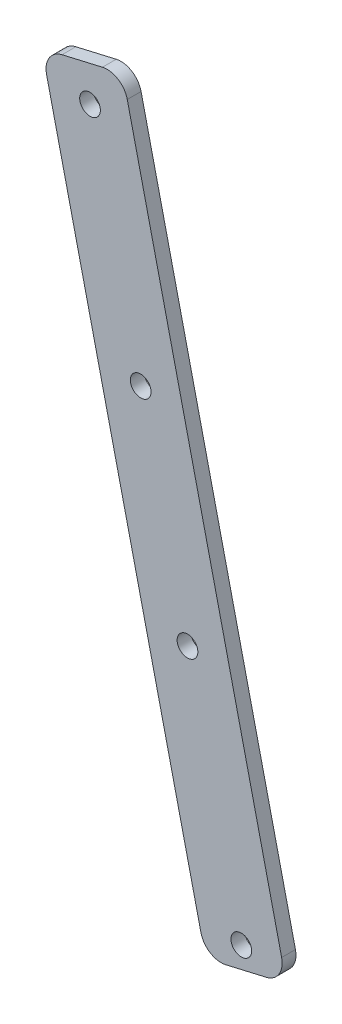
ISO-10303-21;
HEADER;
FILE_DESCRIPTION(('STEP AP214'),'2;1');
FILE_NAME('part.step','',(''),(''),'','','');
FILE_SCHEMA(('AUTOMOTIVE_DESIGN { 1 0 10303 214 1 1 1 1 }'));
ENDSEC;
DATA;
#1=APPLICATION_CONTEXT('core data for automotive mechanical design processes');
#2=APPLICATION_PROTOCOL_DEFINITION('international standard','automotive_design',2000,#1);
#3=PRODUCT_CONTEXT('',#1,'mechanical');
#4=PRODUCT('Part','Part','',(#3));
#5=PRODUCT_RELATED_PRODUCT_CATEGORY('part','',(#4));
#6=PRODUCT_DEFINITION_FORMATION('','',#4);
#7=PRODUCT_DEFINITION_CONTEXT('part definition',#1,'design');
#8=PRODUCT_DEFINITION('design','',#6,#7);
#9=PRODUCT_DEFINITION_SHAPE('','',#8);
#10=(LENGTH_UNIT() NAMED_UNIT(*) SI_UNIT(.MILLI.,.METRE.));
#11=(NAMED_UNIT(*) PLANE_ANGLE_UNIT() SI_UNIT($,.RADIAN.));
#12=(NAMED_UNIT(*) SI_UNIT($,.STERADIAN.) SOLID_ANGLE_UNIT());
#13=UNCERTAINTY_MEASURE_WITH_UNIT(LENGTH_MEASURE(1.E-05),#10,'distance_accuracy_value','');
#14=(GEOMETRIC_REPRESENTATION_CONTEXT(3) GLOBAL_UNCERTAINTY_ASSIGNED_CONTEXT((#13)) GLOBAL_UNIT_ASSIGNED_CONTEXT((#10,
#11,#12)) REPRESENTATION_CONTEXT('',''));
#15=CARTESIAN_POINT('',(0.,0.,0.));
#16=DIRECTION('',(0.,0.,1.));
#17=DIRECTION('',(1.,0.,0.));
#18=AXIS2_PLACEMENT_3D('',#15,#16,#17);
#19=CARTESIAN_POINT('',(11.6435852257325,-63.5112346210582,2.));
#20=DIRECTION('',(0.,0.,1.));
#21=DIRECTION('',(1.,0.,0.));
#22=AXIS2_PLACEMENT_3D('',#19,#20,#21);
#23=PLANE('',#22);
#24=CARTESIAN_POINT('',(6.77492319426459,-29.2249964193636,2.));
#25=DIRECTION('',(0.,0.,1.));
#26=DIRECTION('',(1.,0.,0.));
#27=AXIS2_PLACEMENT_3D('',#24,#25,#26);
#28=CIRCLE('',#27,1.5);
#29=CARTESIAN_POINT('',(8.27492319426459,-29.2249964193636,2.));
#30=VERTEX_POINT('',#29);
#31=EDGE_CURVE('E190',#30,#30,#28,.T.);
#32=ORIENTED_EDGE('',*,*,#31,.F.);
#33=EDGE_LOOP('',(#32));
#34=FACE_BOUND('',#33,.T.);
#35=CARTESIAN_POINT('',(-7.33950012711994,31.660412787644,2.));
#36=DIRECTION('',(0.,0.,1.));
#37=DIRECTION('',(1.,0.,0.));
#38=AXIS2_PLACEMENT_3D('',#35,#36,#37);
#39=CIRCLE('',#38,1.5);
#40=CARTESIAN_POINT('',(-5.83950012711995,31.660412787644,2.));
#41=VERTEX_POINT('',#40);
#42=EDGE_CURVE('E136',#41,#41,#39,.T.);
#43=ORIENTED_EDGE('',*,*,#42,.F.);
#44=EDGE_LOOP('',(#43));
#45=FACE_BOUND('',#44,.T.);
#46=CARTESIAN_POINT('',(11.6435852257325,-63.5112346210582,2.));
#47=DIRECTION('',(0.,0.,1.));
#48=DIRECTION('',(1.,0.,0.));
#49=AXIS2_PLACEMENT_3D('',#46,#47,#48);
#50=CIRCLE('',#49,3.);
#51=CARTESIAN_POINT('',(8.72108558379612,-64.1887269404847,2.));
#52=VERTEX_POINT('',#51);
#53=CARTESIAN_POINT('',(12.3210775451589,-66.4337342629946,2.));
#54=VERTEX_POINT('',#53);
#55=EDGE_CURVE('E147',#52,#54,#50,.T.);
#56=ORIENTED_EDGE('',*,*,#55,.T.);
#57=DIRECTION('',(0.97416654731212,0.225830773142153,0.));
#58=VECTOR('',#57,1.);
#59=CARTESIAN_POINT('',(12.3210775451589,-66.4337342629946,2.));
#60=LINE('',#59,#58);
#61=CARTESIAN_POINT('',(18.1660768290316,-65.0787496241417,2.));
#62=VERTEX_POINT('',#61);
#63=EDGE_CURVE('E95',#54,#62,#60,.T.);
#64=ORIENTED_EDGE('',*,*,#63,.T.);
#65=CARTESIAN_POINT('',(17.4885845096052,-62.1562499822053,2.));
#66=DIRECTION('',(0.,0.,1.));
#67=DIRECTION('',(1.,0.,0.));
#68=AXIS2_PLACEMENT_3D('',#65,#66,#67);
#69=CIRCLE('',#68,3.);
#70=CARTESIAN_POINT('',(20.4110841515416,-61.4787576627788,2.));
#71=VERTEX_POINT('',#70);
#72=EDGE_CURVE('E162',#62,#71,#69,.T.);
#73=ORIENTED_EDGE('',*,*,#72,.T.);
#74=DIRECTION('',(-0.225830773142153,0.97416654731212,0.));
#75=VECTOR('',#74,1.);
#76=CARTESIAN_POINT('',(20.4110841515416,-61.4787576627788,2.));
#77=LINE('',#76,#75);
#78=CARTESIAN_POINT('',(-1.94616238953154,34.9637305211211,2.));
#79=VERTEX_POINT('',#78);
#80=EDGE_CURVE('E175',#71,#79,#77,.T.);
#81=ORIENTED_EDGE('',*,*,#80,.T.);
#82=CARTESIAN_POINT('',(-4.8686620314679,34.2862382016946,2.));
#83=DIRECTION('',(0.,0.,1.));
#84=DIRECTION('',(1.,0.,0.));
#85=AXIS2_PLACEMENT_3D('',#82,#83,#84);
#86=CIRCLE('',#85,3.);
#87=CARTESIAN_POINT('',(-5.54615435089436,37.208737843631,2.));
#88=VERTEX_POINT('',#87);
#89=EDGE_CURVE('E114',#79,#88,#86,.T.);
#90=ORIENTED_EDGE('',*,*,#89,.T.);
#91=DIRECTION('',(-0.97416654731212,-0.225830773142152,0.));
#92=VECTOR('',#91,1.);
#93=CARTESIAN_POINT('',(-5.54615435089436,37.208737843631,2.));
#94=LINE('',#93,#92);
#95=CARTESIAN_POINT('',(-11.3911536347671,35.8537532047781,2.));
#96=VERTEX_POINT('',#95);
#97=EDGE_CURVE('E108',#88,#96,#94,.T.);
#98=ORIENTED_EDGE('',*,*,#97,.T.);
#99=CARTESIAN_POINT('',(-10.7136613153406,32.9312535628417,2.));
#100=DIRECTION('',(0.,0.,1.));
#101=DIRECTION('',(1.,0.,0.));
#102=AXIS2_PLACEMENT_3D('',#99,#100,#101);
#103=CIRCLE('',#102,3.);
#104=CARTESIAN_POINT('',(-13.636160957277,32.2537612434152,2.));
#105=VERTEX_POINT('',#104);
#106=EDGE_CURVE('E112',#96,#105,#103,.T.);
#107=ORIENTED_EDGE('',*,*,#106,.T.);
#108=DIRECTION('',(0.225830773142153,-0.97416654731212,0.));
#109=VECTOR('',#108,1.);
#110=CARTESIAN_POINT('',(-13.636160957277,32.2537612434152,2.));
#111=LINE('',#110,#109);
#112=EDGE_CURVE('E52',#105,#52,#111,.T.);
#113=ORIENTED_EDGE('',*,*,#112,.T.);
#114=EDGE_LOOP('',(#56,#64,#73,#81,#90,#98,#107,#113));
#115=FACE_BOUND('',#114,.T.);
#116=CARTESIAN_POINT('',(0.,0.,2.));
#117=DIRECTION('',(0.,0.,1.));
#118=DIRECTION('',(1.,0.,0.));
#119=AXIS2_PLACEMENT_3D('',#116,#117,#118);
#120=CIRCLE('',#119,1.5);
#121=CARTESIAN_POINT('',(1.5,0.,2.));
#122=VERTEX_POINT('',#121);
#123=EDGE_CURVE('E184',#122,#122,#120,.T.);
#124=ORIENTED_EDGE('',*,*,#123,.F.);
#125=EDGE_LOOP('',(#124));
#126=FACE_BOUND('',#125,.T.);
#127=CARTESIAN_POINT('',(14.5660848676688,-62.8337423016317,2.));
#128=DIRECTION('',(0.,0.,1.));
#129=DIRECTION('',(1.,0.,0.));
#130=AXIS2_PLACEMENT_3D('',#127,#128,#129);
#131=CIRCLE('',#130,1.5);
#132=CARTESIAN_POINT('',(16.0660848676688,-62.8337423016317,2.));
#133=VERTEX_POINT('',#132);
#134=EDGE_CURVE('E196',#133,#133,#131,.T.);
#135=ORIENTED_EDGE('',*,*,#134,.F.);
#136=EDGE_LOOP('',(#135));
#137=FACE_BOUND('',#136,.T.);
#138=ADVANCED_FACE('F35',(#34,#45,#115,#126,#137),#23,.T.);
#139=CARTESIAN_POINT('',(11.6435852257325,-63.5112346210582,0.));
#140=DIRECTION('',(0.,0.,1.));
#141=DIRECTION('',(1.,0.,0.));
#142=AXIS2_PLACEMENT_3D('',#139,#140,#141);
#143=PLANE('',#142);
#144=CARTESIAN_POINT('',(11.6435852257325,-63.5112346210582,0.));
#145=DIRECTION('',(0.,0.,1.));
#146=DIRECTION('',(1.,0.,0.));
#147=AXIS2_PLACEMENT_3D('',#144,#145,#146);
#148=CIRCLE('',#147,3.);
#149=CARTESIAN_POINT('',(8.72108558379612,-64.1887269404847,0.));
#150=VERTEX_POINT('',#149);
#151=CARTESIAN_POINT('',(12.3210775451589,-66.4337342629946,0.));
#152=VERTEX_POINT('',#151);
#153=EDGE_CURVE('E132',#150,#152,#148,.T.);
#154=ORIENTED_EDGE('',*,*,#153,.F.);
#155=DIRECTION('',(0.225830773142153,-0.97416654731212,0.));
#156=VECTOR('',#155,1.);
#157=CARTESIAN_POINT('',(-13.636160957277,32.2537612434152,0.));
#158=LINE('',#157,#156);
#159=CARTESIAN_POINT('',(-13.636160957277,32.2537612434152,0.));
#160=VERTEX_POINT('',#159);
#161=EDGE_CURVE('E87',#160,#150,#158,.T.);
#162=ORIENTED_EDGE('',*,*,#161,.F.);
#163=CARTESIAN_POINT('',(-10.7136613153406,32.9312535628417,0.));
#164=DIRECTION('',(0.,0.,1.));
#165=DIRECTION('',(1.,0.,0.));
#166=AXIS2_PLACEMENT_3D('',#163,#164,#165);
#167=CIRCLE('',#166,3.);
#168=CARTESIAN_POINT('',(-11.3911536347671,35.8537532047781,0.));
#169=VERTEX_POINT('',#168);
#170=EDGE_CURVE('E81',#169,#160,#167,.T.);
#171=ORIENTED_EDGE('',*,*,#170,.F.);
#172=DIRECTION('',(-0.97416654731212,-0.225830773142152,0.));
#173=VECTOR('',#172,1.);
#174=CARTESIAN_POINT('',(-5.54615435089436,37.208737843631,0.));
#175=LINE('',#174,#173);
#176=CARTESIAN_POINT('',(-5.54615435089436,37.208737843631,0.));
#177=VERTEX_POINT('',#176);
#178=EDGE_CURVE('E122',#177,#169,#175,.T.);
#179=ORIENTED_EDGE('',*,*,#178,.F.);
#180=CARTESIAN_POINT('',(-4.8686620314679,34.2862382016946,0.));
#181=DIRECTION('',(0.,0.,1.));
#182=DIRECTION('',(1.,0.,0.));
#183=AXIS2_PLACEMENT_3D('',#180,#181,#182);
#184=CIRCLE('',#183,3.);
#185=CARTESIAN_POINT('',(-1.94616238953154,34.9637305211211,0.));
#186=VERTEX_POINT('',#185);
#187=EDGE_CURVE('E142',#186,#177,#184,.T.);
#188=ORIENTED_EDGE('',*,*,#187,.F.);
#189=DIRECTION('',(-0.225830773142153,0.97416654731212,0.));
#190=VECTOR('',#189,1.);
#191=CARTESIAN_POINT('',(20.4110841515416,-61.4787576627788,0.));
#192=LINE('',#191,#190);
#193=CARTESIAN_POINT('',(20.4110841515416,-61.4787576627788,0.));
#194=VERTEX_POINT('',#193);
#195=EDGE_CURVE('E140',#194,#186,#192,.T.);
#196=ORIENTED_EDGE('',*,*,#195,.F.);
#197=CARTESIAN_POINT('',(17.4885845096052,-62.1562499822053,0.));
#198=DIRECTION('',(0.,0.,1.));
#199=DIRECTION('',(1.,0.,0.));
#200=AXIS2_PLACEMENT_3D('',#197,#198,#199);
#201=CIRCLE('',#200,3.);
#202=CARTESIAN_POINT('',(18.1660768290316,-65.0787496241417,0.));
#203=VERTEX_POINT('',#202);
#204=EDGE_CURVE('E138',#203,#194,#201,.T.);
#205=ORIENTED_EDGE('',*,*,#204,.F.);
#206=DIRECTION('',(0.97416654731212,0.225830773142153,0.));
#207=VECTOR('',#206,1.);
#208=CARTESIAN_POINT('',(12.3210775451589,-66.4337342629946,0.));
#209=LINE('',#208,#207);
#210=EDGE_CURVE('E135',#152,#203,#209,.T.);
#211=ORIENTED_EDGE('',*,*,#210,.F.);
#212=EDGE_LOOP('',(#154,#162,#171,#179,#188,#196,#205,#211));
#213=FACE_BOUND('',#212,.T.);
#214=CARTESIAN_POINT('',(-7.33950012711994,31.660412787644,0.));
#215=DIRECTION('',(0.,0.,1.));
#216=DIRECTION('',(1.,0.,0.));
#217=AXIS2_PLACEMENT_3D('',#214,#215,#216);
#218=CIRCLE('',#217,1.5);
#219=CARTESIAN_POINT('',(-5.83950012711995,31.660412787644,0.));
#220=VERTEX_POINT('',#219);
#221=EDGE_CURVE('E181',#220,#220,#218,.T.);
#222=ORIENTED_EDGE('',*,*,#221,.T.);
#223=EDGE_LOOP('',(#222));
#224=FACE_BOUND('',#223,.T.);
#225=CARTESIAN_POINT('',(0.,0.,0.));
#226=DIRECTION('',(0.,0.,1.));
#227=DIRECTION('',(1.,0.,0.));
#228=AXIS2_PLACEMENT_3D('',#225,#226,#227);
#229=CIRCLE('',#228,1.5);
#230=CARTESIAN_POINT('',(1.5,0.,0.));
#231=VERTEX_POINT('',#230);
#232=EDGE_CURVE('E187',#231,#231,#229,.T.);
#233=ORIENTED_EDGE('',*,*,#232,.T.);
#234=EDGE_LOOP('',(#233));
#235=FACE_BOUND('',#234,.T.);
#236=CARTESIAN_POINT('',(6.77492319426459,-29.2249964193636,0.));
#237=DIRECTION('',(0.,0.,1.));
#238=DIRECTION('',(1.,0.,0.));
#239=AXIS2_PLACEMENT_3D('',#236,#237,#238);
#240=CIRCLE('',#239,1.5);
#241=CARTESIAN_POINT('',(8.27492319426459,-29.2249964193636,0.));
#242=VERTEX_POINT('',#241);
#243=EDGE_CURVE('E193',#242,#242,#240,.T.);
#244=ORIENTED_EDGE('',*,*,#243,.T.);
#245=EDGE_LOOP('',(#244));
#246=FACE_BOUND('',#245,.T.);
#247=CARTESIAN_POINT('',(14.5660848676688,-62.8337423016317,0.));
#248=DIRECTION('',(0.,0.,1.));
#249=DIRECTION('',(1.,0.,0.));
#250=AXIS2_PLACEMENT_3D('',#247,#248,#249);
#251=CIRCLE('',#250,1.5);
#252=CARTESIAN_POINT('',(16.0660848676688,-62.8337423016317,0.));
#253=VERTEX_POINT('',#252);
#254=EDGE_CURVE('E199',#253,#253,#251,.T.);
#255=ORIENTED_EDGE('',*,*,#254,.T.);
#256=EDGE_LOOP('',(#255));
#257=FACE_BOUND('',#256,.T.);
#258=ADVANCED_FACE('F166',(#213,#224,#235,#246,#257),#143,.F.);
#259=CARTESIAN_POINT('',(11.6435852257325,-63.5112346210582,2.));
#260=DIRECTION('',(0.,0.,-1.));
#261=DIRECTION('',(-1.,0.,0.));
#262=AXIS2_PLACEMENT_3D('',#259,#260,#261);
#263=CYLINDRICAL_SURFACE('',#262,3.);
#264=ORIENTED_EDGE('',*,*,#153,.T.);
#265=DIRECTION('',(0.,0.,-1.));
#266=VECTOR('',#265,1.);
#267=CARTESIAN_POINT('',(12.3210775451589,-66.4337342629946,2.));
#268=LINE('',#267,#266);
#269=EDGE_CURVE('E11',#54,#152,#268,.T.);
#270=ORIENTED_EDGE('',*,*,#269,.F.);
#271=ORIENTED_EDGE('',*,*,#55,.F.);
#272=DIRECTION('',(0.,0.,-1.));
#273=VECTOR('',#272,1.);
#274=CARTESIAN_POINT('',(8.72108558379612,-64.1887269404847,2.));
#275=LINE('',#274,#273);
#276=EDGE_CURVE('E128',#52,#150,#275,.T.);
#277=ORIENTED_EDGE('',*,*,#276,.T.);
#278=EDGE_LOOP('',(#264,#270,#271,#277));
#279=FACE_BOUND('',#278,.T.);
#280=ADVANCED_FACE('F37',(#279),#263,.T.);
#281=CARTESIAN_POINT('',(12.3210775451589,-66.4337342629946,2.));
#282=DIRECTION('',(-0.225830773142153,0.97416654731212,0.));
#283=DIRECTION('',(-0.97416654731212,-0.225830773142153,0.));
#284=AXIS2_PLACEMENT_3D('',#281,#282,#283);
#285=PLANE('',#284);
#286=ORIENTED_EDGE('',*,*,#210,.T.);
#287=DIRECTION('',(0.,0.,-1.));
#288=VECTOR('',#287,1.);
#289=CARTESIAN_POINT('',(18.1660768290316,-65.0787496241417,2.));
#290=LINE('',#289,#288);
#291=EDGE_CURVE('E44',#62,#203,#290,.T.);
#292=ORIENTED_EDGE('',*,*,#291,.F.);
#293=ORIENTED_EDGE('',*,*,#63,.F.);
#294=ORIENTED_EDGE('',*,*,#269,.T.);
#295=EDGE_LOOP('',(#286,#292,#293,#294));
#296=FACE_BOUND('',#295,.T.);
#297=ADVANCED_FACE('F233',(#296),#285,.F.);
#298=CARTESIAN_POINT('',(17.4885845096052,-62.1562499822053,2.));
#299=DIRECTION('',(0.,0.,-1.));
#300=DIRECTION('',(-1.,0.,0.));
#301=AXIS2_PLACEMENT_3D('',#298,#299,#300);
#302=CYLINDRICAL_SURFACE('',#301,3.);
#303=ORIENTED_EDGE('',*,*,#204,.T.);
#304=DIRECTION('',(0.,0.,-1.));
#305=VECTOR('',#304,1.);
#306=CARTESIAN_POINT('',(20.4110841515416,-61.4787576627788,2.));
#307=LINE('',#306,#305);
#308=EDGE_CURVE('E154',#71,#194,#307,.T.);
#309=ORIENTED_EDGE('',*,*,#308,.F.);
#310=ORIENTED_EDGE('',*,*,#72,.F.);
#311=ORIENTED_EDGE('',*,*,#291,.T.);
#312=EDGE_LOOP('',(#303,#309,#310,#311));
#313=FACE_BOUND('',#312,.T.);
#314=ADVANCED_FACE('F160',(#313),#302,.T.);
#315=CARTESIAN_POINT('',(20.4110841515416,-61.4787576627788,2.));
#316=DIRECTION('',(-0.97416654731212,-0.225830773142153,0.));
#317=DIRECTION('',(0.225830773142153,-0.97416654731212,0.));
#318=AXIS2_PLACEMENT_3D('',#315,#316,#317);
#319=PLANE('',#318);
#320=ORIENTED_EDGE('',*,*,#195,.T.);
#321=DIRECTION('',(0.,0.,-1.));
#322=VECTOR('',#321,1.);
#323=CARTESIAN_POINT('',(-1.94616238953154,34.9637305211211,2.));
#324=LINE('',#323,#322);
#325=EDGE_CURVE('E151',#79,#186,#324,.T.);
#326=ORIENTED_EDGE('',*,*,#325,.F.);
#327=ORIENTED_EDGE('',*,*,#80,.F.);
#328=ORIENTED_EDGE('',*,*,#308,.T.);
#329=EDGE_LOOP('',(#320,#326,#327,#328));
#330=FACE_BOUND('',#329,.T.);
#331=ADVANCED_FACE('F171',(#330),#319,.F.);
#332=CARTESIAN_POINT('',(-4.8686620314679,34.2862382016946,2.));
#333=DIRECTION('',(0.,0.,-1.));
#334=DIRECTION('',(-1.,0.,0.));
#335=AXIS2_PLACEMENT_3D('',#332,#333,#334);
#336=CYLINDRICAL_SURFACE('',#335,3.);
#337=ORIENTED_EDGE('',*,*,#187,.T.);
#338=DIRECTION('',(0.,0.,-1.));
#339=VECTOR('',#338,1.);
#340=CARTESIAN_POINT('',(-5.54615435089436,37.208737843631,2.));
#341=LINE('',#340,#339);
#342=EDGE_CURVE('E123',#88,#177,#341,.T.);
#343=ORIENTED_EDGE('',*,*,#342,.F.);
#344=ORIENTED_EDGE('',*,*,#89,.F.);
#345=ORIENTED_EDGE('',*,*,#325,.T.);
#346=EDGE_LOOP('',(#337,#343,#344,#345));
#347=FACE_BOUND('',#346,.T.);
#348=ADVANCED_FACE('F174',(#347),#336,.T.);
#349=CARTESIAN_POINT('',(-5.54615435089436,37.208737843631,2.));
#350=DIRECTION('',(0.225830773142152,-0.97416654731212,0.));
#351=DIRECTION('',(0.97416654731212,0.225830773142152,0.));
#352=AXIS2_PLACEMENT_3D('',#349,#350,#351);
#353=PLANE('',#352);
#354=ORIENTED_EDGE('',*,*,#178,.T.);
#355=DIRECTION('',(0.,0.,-1.));
#356=VECTOR('',#355,1.);
#357=CARTESIAN_POINT('',(-11.3911536347671,35.8537532047781,2.));
#358=LINE('',#357,#356);
#359=EDGE_CURVE('E119',#96,#169,#358,.T.);
#360=ORIENTED_EDGE('',*,*,#359,.F.);
#361=ORIENTED_EDGE('',*,*,#97,.F.);
#362=ORIENTED_EDGE('',*,*,#342,.T.);
#363=EDGE_LOOP('',(#354,#360,#361,#362));
#364=FACE_BOUND('',#363,.T.);
#365=ADVANCED_FACE('F120',(#364),#353,.F.);
#366=CARTESIAN_POINT('',(-10.7136613153406,32.9312535628417,2.));
#367=DIRECTION('',(0.,0.,-1.));
#368=DIRECTION('',(-1.,0.,0.));
#369=AXIS2_PLACEMENT_3D('',#366,#367,#368);
#370=CYLINDRICAL_SURFACE('',#369,3.);
#371=ORIENTED_EDGE('',*,*,#170,.T.);
#372=DIRECTION('',(0.,0.,-1.));
#373=VECTOR('',#372,1.);
#374=CARTESIAN_POINT('',(-13.636160957277,32.2537612434152,2.));
#375=LINE('',#374,#373);
#376=EDGE_CURVE('E124',#105,#160,#375,.T.);
#377=ORIENTED_EDGE('',*,*,#376,.F.);
#378=ORIENTED_EDGE('',*,*,#106,.F.);
#379=ORIENTED_EDGE('',*,*,#359,.T.);
#380=EDGE_LOOP('',(#371,#377,#378,#379));
#381=FACE_BOUND('',#380,.T.);
#382=ADVANCED_FACE('F126',(#381),#370,.T.);
#383=CARTESIAN_POINT('',(-13.636160957277,32.2537612434152,2.));
#384=DIRECTION('',(0.97416654731212,0.225830773142153,0.));
#385=DIRECTION('',(-0.225830773142153,0.97416654731212,0.));
#386=AXIS2_PLACEMENT_3D('',#383,#384,#385);
#387=PLANE('',#386);
#388=ORIENTED_EDGE('',*,*,#161,.T.);
#389=ORIENTED_EDGE('',*,*,#276,.F.);
#390=ORIENTED_EDGE('',*,*,#112,.F.);
#391=ORIENTED_EDGE('',*,*,#376,.T.);
#392=EDGE_LOOP('',(#388,#389,#390,#391));
#393=FACE_BOUND('',#392,.T.);
#394=ADVANCED_FACE('F221',(#393),#387,.F.);
#395=CARTESIAN_POINT('',(-7.33950012711994,31.660412787644,2.));
#396=DIRECTION('',(0.,0.,-1.));
#397=DIRECTION('',(-1.,0.,0.));
#398=AXIS2_PLACEMENT_3D('',#395,#396,#397);
#399=CYLINDRICAL_SURFACE('',#398,1.5);
#400=ORIENTED_EDGE('',*,*,#42,.T.);
#401=EDGE_LOOP('',(#400));
#402=FACE_BOUND('',#401,.T.);
#403=ORIENTED_EDGE('',*,*,#221,.F.);
#404=EDGE_LOOP('',(#403));
#405=FACE_BOUND('',#404,.T.);
#406=ADVANCED_FACE('F218',(#402,#405),#399,.F.);
#407=CARTESIAN_POINT('',(0.,0.,2.));
#408=DIRECTION('',(0.,0.,-1.));
#409=DIRECTION('',(-1.,0.,0.));
#410=AXIS2_PLACEMENT_3D('',#407,#408,#409);
#411=CYLINDRICAL_SURFACE('',#410,1.5);
#412=ORIENTED_EDGE('',*,*,#123,.T.);
#413=EDGE_LOOP('',(#412));
#414=FACE_BOUND('',#413,.T.);
#415=ORIENTED_EDGE('',*,*,#232,.F.);
#416=EDGE_LOOP('',(#415));
#417=FACE_BOUND('',#416,.T.);
#418=ADVANCED_FACE('F297',(#414,#417),#411,.F.);
#419=CARTESIAN_POINT('',(6.77492319426459,-29.2249964193636,2.));
#420=DIRECTION('',(0.,0.,-1.));
#421=DIRECTION('',(-1.,0.,0.));
#422=AXIS2_PLACEMENT_3D('',#419,#420,#421);
#423=CYLINDRICAL_SURFACE('',#422,1.5);
#424=ORIENTED_EDGE('',*,*,#31,.T.);
#425=EDGE_LOOP('',(#424));
#426=FACE_BOUND('',#425,.T.);
#427=ORIENTED_EDGE('',*,*,#243,.F.);
#428=EDGE_LOOP('',(#427));
#429=FACE_BOUND('',#428,.T.);
#430=ADVANCED_FACE('F305',(#426,#429),#423,.F.);
#431=CARTESIAN_POINT('',(14.5660848676688,-62.8337423016317,2.));
#432=DIRECTION('',(0.,0.,-1.));
#433=DIRECTION('',(-1.,0.,0.));
#434=AXIS2_PLACEMENT_3D('',#431,#432,#433);
#435=CYLINDRICAL_SURFACE('',#434,1.5);
#436=ORIENTED_EDGE('',*,*,#134,.T.);
#437=EDGE_LOOP('',(#436));
#438=FACE_BOUND('',#437,.T.);
#439=ORIENTED_EDGE('',*,*,#254,.F.);
#440=EDGE_LOOP('',(#439));
#441=FACE_BOUND('',#440,.T.);
#442=ADVANCED_FACE('F205',(#438,#441),#435,.F.);
#443=CLOSED_SHELL('',(#138,#258,#280,#297,#314,#331,#348,#365,#382,#394,#406,#418,#430,#442));
#444=MANIFOLD_SOLID_BREP('B2',#443);
#445=ADVANCED_BREP_SHAPE_REPRESENTATION('',(#18,#444),#14);
#446=SHAPE_DEFINITION_REPRESENTATION(#9,#445);
ENDSEC;
END-ISO-10303-21;
